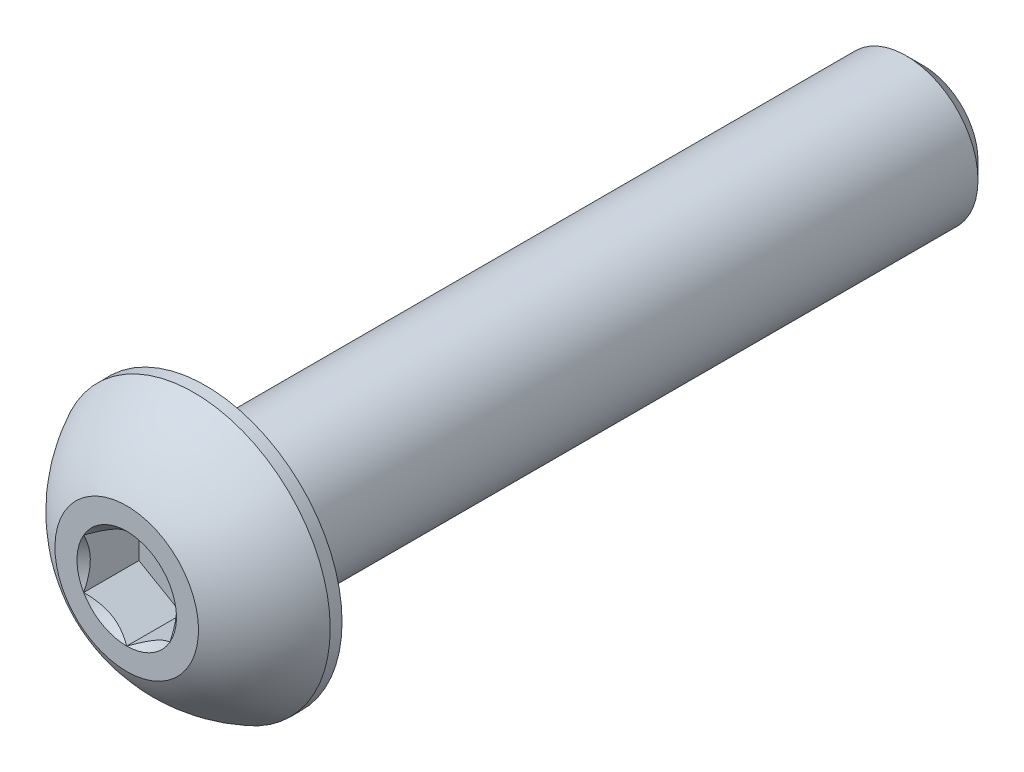
ISO-10303-21;
HEADER;
FILE_DESCRIPTION(('STEP AP214'),'2;1');
FILE_NAME('part.step','',(''),(''),'','','');
FILE_SCHEMA(('AUTOMOTIVE_DESIGN { 1 0 10303 214 1 1 1 1 }'));
ENDSEC;
DATA;
#1=APPLICATION_CONTEXT('core data for automotive mechanical design processes');
#2=APPLICATION_PROTOCOL_DEFINITION('international standard','automotive_design',2000,#1);
#3=PRODUCT_CONTEXT('',#1,'mechanical');
#4=PRODUCT('Part','Part','',(#3));
#5=PRODUCT_RELATED_PRODUCT_CATEGORY('part','',(#4));
#6=PRODUCT_DEFINITION_FORMATION('','',#4);
#7=PRODUCT_DEFINITION_CONTEXT('part definition',#1,'design');
#8=PRODUCT_DEFINITION('design','',#6,#7);
#9=PRODUCT_DEFINITION_SHAPE('','',#8);
#10=(LENGTH_UNIT() NAMED_UNIT(*) SI_UNIT(.MILLI.,.METRE.));
#11=(NAMED_UNIT(*) PLANE_ANGLE_UNIT() SI_UNIT($,.RADIAN.));
#12=(NAMED_UNIT(*) SI_UNIT($,.STERADIAN.) SOLID_ANGLE_UNIT());
#13=UNCERTAINTY_MEASURE_WITH_UNIT(LENGTH_MEASURE(1.E-05),#10,'distance_accuracy_value','');
#14=(GEOMETRIC_REPRESENTATION_CONTEXT(3) GLOBAL_UNCERTAINTY_ASSIGNED_CONTEXT((#13)) GLOBAL_UNIT_ASSIGNED_CONTEXT((#10,
#11,#12)) REPRESENTATION_CONTEXT('',''));
#15=CARTESIAN_POINT('',(0.,0.,0.));
#16=DIRECTION('',(0.,0.,1.));
#17=DIRECTION('',(1.,0.,0.));
#18=AXIS2_PLACEMENT_3D('',#15,#16,#17);
#19=CARTESIAN_POINT('',(0.,0.,-27.75));
#20=DIRECTION('',(0.,0.,1.));
#21=DIRECTION('',(1.,0.,0.));
#22=AXIS2_PLACEMENT_3D('',#19,#20,#21);
#23=PLANE('',#22);
#24=CARTESIAN_POINT('',(0.,0.,-27.75));
#25=DIRECTION('',(0.,0.,1.));
#26=DIRECTION('',(1.,0.,0.));
#27=AXIS2_PLACEMENT_3D('',#24,#25,#26);
#28=CIRCLE('',#27,1.90000000000001);
#29=CARTESIAN_POINT('',(1.90000000000001,0.,-27.75));
#30=VERTEX_POINT('',#29);
#31=EDGE_CURVE('E45',#30,#30,#28,.T.);
#32=ORIENTED_EDGE('',*,*,#31,.F.);
#33=EDGE_LOOP('',(#32));
#34=FACE_BOUND('',#33,.T.);
#35=ADVANCED_FACE('F42',(#34),#23,.F.);
#36=CARTESIAN_POINT('',(0.,0.,-27.75));
#37=DIRECTION('',(0.,0.,1.));
#38=DIRECTION('',(1.,0.,0.));
#39=AXIS2_PLACEMENT_3D('',#36,#37,#38);
#40=CONICAL_SURFACE('',#39,1.90000000000001,0.785398163397448);
#41=CARTESIAN_POINT('',(0.,0.,-27.15));
#42=DIRECTION('',(0.,0.,1.));
#43=DIRECTION('',(1.,0.,0.));
#44=AXIS2_PLACEMENT_3D('',#41,#42,#43);
#45=CIRCLE('',#44,2.50000000000001);
#46=CARTESIAN_POINT('',(2.50000000000001,0.,-27.15));
#47=VERTEX_POINT('',#46);
#48=EDGE_CURVE('E138',#47,#47,#45,.T.);
#49=ORIENTED_EDGE('',*,*,#48,.F.);
#50=EDGE_LOOP('',(#49));
#51=FACE_BOUND('',#50,.T.);
#52=ORIENTED_EDGE('',*,*,#31,.T.);
#53=EDGE_LOOP('',(#52));
#54=FACE_BOUND('',#53,.T.);
#55=ADVANCED_FACE('F159',(#51,#54),#40,.T.);
#56=CARTESIAN_POINT('',(0.,0.,0.));
#57=DIRECTION('',(0.,0.,1.));
#58=DIRECTION('',(1.,0.,0.));
#59=AXIS2_PLACEMENT_3D('',#56,#57,#58);
#60=CYLINDRICAL_SURFACE('',#59,2.50000000000001);
#61=CARTESIAN_POINT('',(0.,0.,-2.75));
#62=DIRECTION('',(0.,0.,1.));
#63=DIRECTION('',(1.,0.,0.));
#64=AXIS2_PLACEMENT_3D('',#61,#62,#63);
#65=CIRCLE('',#64,2.50000000000001);
#66=CARTESIAN_POINT('',(2.50000000000001,0.,-2.75));
#67=VERTEX_POINT('',#66);
#68=EDGE_CURVE('E12',#67,#67,#65,.T.);
#69=ORIENTED_EDGE('',*,*,#68,.F.);
#70=EDGE_LOOP('',(#69));
#71=FACE_BOUND('',#70,.T.);
#72=ORIENTED_EDGE('',*,*,#48,.T.);
#73=EDGE_LOOP('',(#72));
#74=FACE_BOUND('',#73,.T.);
#75=ADVANCED_FACE('F166',(#71,#74),#60,.T.);
#76=CARTESIAN_POINT('',(4.75,0.,-2.75));
#77=DIRECTION('',(0.,0.,-1.));
#78=DIRECTION('',(-1.,0.,0.));
#79=AXIS2_PLACEMENT_3D('',#76,#77,#78);
#80=PLANE('',#79);
#81=ORIENTED_EDGE('',*,*,#68,.T.);
#82=EDGE_LOOP('',(#81));
#83=FACE_BOUND('',#82,.T.);
#84=CARTESIAN_POINT('',(0.,0.,-2.75));
#85=DIRECTION('',(0.,0.,1.));
#86=DIRECTION('',(1.,0.,0.));
#87=AXIS2_PLACEMENT_3D('',#84,#85,#86);
#88=CIRCLE('',#87,4.75);
#89=CARTESIAN_POINT('',(4.75,0.,-2.75));
#90=VERTEX_POINT('',#89);
#91=EDGE_CURVE('E260',#90,#90,#88,.T.);
#92=ORIENTED_EDGE('',*,*,#91,.F.);
#93=EDGE_LOOP('',(#92));
#94=FACE_BOUND('',#93,.T.);
#95=ADVANCED_FACE('F169',(#83,#94),#80,.T.);
#96=CARTESIAN_POINT('',(1.5,-0.866025403784436,-1.925));
#97=DIRECTION('',(0.,0.,1.));
#98=DIRECTION('',(1.,0.,0.));
#99=AXIS2_PLACEMENT_3D('',#96,#97,#98);
#100=PLANE('',#99);
#101=DIRECTION('',(0.866025403784438,0.5,0.));
#102=VECTOR('',#101,1.);
#103=CARTESIAN_POINT('',(0.,-1.73205080756888,-1.925));
#104=LINE('',#103,#102);
#105=CARTESIAN_POINT('',(0.,-1.73205080756888,-1.925));
#106=VERTEX_POINT('',#105);
#107=CARTESIAN_POINT('',(1.5,-0.866025403784436,-1.925));
#108=VERTEX_POINT('',#107);
#109=EDGE_CURVE('E113',#106,#108,#104,.T.);
#110=ORIENTED_EDGE('',*,*,#109,.T.);
#111=DIRECTION('',(0.,1.,0.));
#112=VECTOR('',#111,1.);
#113=CARTESIAN_POINT('',(1.5,-0.866025403784436,-1.925));
#114=LINE('',#113,#112);
#115=CARTESIAN_POINT('',(1.5,0.866025403784438,-1.925));
#116=VERTEX_POINT('',#115);
#117=EDGE_CURVE('E296',#108,#116,#114,.T.);
#118=ORIENTED_EDGE('',*,*,#117,.T.);
#119=DIRECTION('',(-0.866025403784439,0.5,0.));
#120=VECTOR('',#119,1.);
#121=CARTESIAN_POINT('',(1.5,0.866025403784438,-1.925));
#122=LINE('',#121,#120);
#123=CARTESIAN_POINT('',(0.,1.73205080756888,-1.925));
#124=VERTEX_POINT('',#123);
#125=EDGE_CURVE('E292',#116,#124,#122,.T.);
#126=ORIENTED_EDGE('',*,*,#125,.T.);
#127=DIRECTION('',(-0.866025403784439,-0.5,0.));
#128=VECTOR('',#127,1.);
#129=CARTESIAN_POINT('',(0.,1.73205080756888,-1.925));
#130=LINE('',#129,#128);
#131=CARTESIAN_POINT('',(-1.5,0.866025403784438,-1.925));
#132=VERTEX_POINT('',#131);
#133=EDGE_CURVE('E288',#124,#132,#130,.T.);
#134=ORIENTED_EDGE('',*,*,#133,.T.);
#135=DIRECTION('',(0.,-1.,0.));
#136=VECTOR('',#135,1.);
#137=CARTESIAN_POINT('',(-1.5,0.866025403784438,-1.925));
#138=LINE('',#137,#136);
#139=CARTESIAN_POINT('',(-1.5,-0.866025403784438,-1.925));
#140=VERTEX_POINT('',#139);
#141=EDGE_CURVE('E284',#132,#140,#138,.T.);
#142=ORIENTED_EDGE('',*,*,#141,.T.);
#143=DIRECTION('',(0.866025403784439,-0.5,0.));
#144=VECTOR('',#143,1.);
#145=CARTESIAN_POINT('',(-1.5,-0.866025403784438,-1.925));
#146=LINE('',#145,#144);
#147=EDGE_CURVE('E268',#140,#106,#146,.T.);
#148=ORIENTED_EDGE('',*,*,#147,.T.);
#149=EDGE_LOOP('',(#110,#118,#126,#134,#142,#148));
#150=FACE_BOUND('',#149,.T.);
#151=ADVANCED_FACE('F162',(#150),#100,.T.);
#152=CARTESIAN_POINT('',(-1.5,-0.866025403784438,-1.925));
#153=DIRECTION('',(-0.5,-0.866025403784439,0.));
#154=DIRECTION('',(0.866025403784439,-0.5,0.));
#155=AXIS2_PLACEMENT_3D('',#152,#153,#154);
#156=PLANE('',#155);
#157=DIRECTION('',(0.,0.,1.));
#158=VECTOR('',#157,1.);
#159=CARTESIAN_POINT('',(-1.5,-0.866025403784438,-1.925));
#160=LINE('',#159,#158);
#161=CARTESIAN_POINT('',(-1.5,-0.866025403784439,0.));
#162=VERTEX_POINT('',#161);
#163=EDGE_CURVE('E120',#140,#162,#160,.T.);
#164=ORIENTED_EDGE('',*,*,#163,.T.);
#165=CARTESIAN_POINT('',(-1.5002,-0.8659099337306,0.000115481600073141));
#166=CARTESIAN_POINT('',(-1.44863220926292,-0.895682611594165,-0.0296345239326726));
#167=CARTESIAN_POINT('',(-1.3962020823348,-0.925953159489764,-0.0576375160896876));
#168=CARTESIAN_POINT('',(-1.2892909659444,-0.987678321317123,-0.108910769559857));
#169=CARTESIAN_POINT('',(-1.23479980418534,-1.01913880822717,-0.132152494955627));
#170=CARTESIAN_POINT('',(-1.12492091864275,-1.08257741237344,-0.17196627100778));
#171=CARTESIAN_POINT('',(-1.0695611909048,-1.11453936608521,-0.188638414329104));
#172=CARTESIAN_POINT('',(-0.957622742522848,-1.1791670593912,-0.214325543181897));
#173=CARTESIAN_POINT('',(-0.90104744344699,-1.21183082354213,-0.223359709521134));
#174=CARTESIAN_POINT('',(-0.803544610483558,-1.26812411040032,-0.231510918773148));
#175=CARTESIAN_POINT('',(-0.762743091719533,-1.29168087824208,-0.232717747010783));
#176=CARTESIAN_POINT('',(-0.681212030384141,-1.33875285845138,-0.230685942837732));
#177=CARTESIAN_POINT('',(-0.640482505685369,-1.36226806050018,-0.227446329251692));
#178=CARTESIAN_POINT('',(-0.559415597836583,-1.40907206156905,-0.216708014018038));
#179=CARTESIAN_POINT('',(-0.519078615401711,-1.43236062923612,-0.209205346981267));
#180=CARTESIAN_POINT('',(-0.439081663085968,-1.47854689118996,-0.190348388071709));
#181=CARTESIAN_POINT('',(-0.399421991483791,-1.50144441326545,-0.178992442981415));
#182=CARTESIAN_POINT('',(-0.297836865225515,-1.56009461325633,-0.145278352407328));
#183=CARTESIAN_POINT('',(-0.236541446290311,-1.59548353987866,-0.120378150906633));
#184=CARTESIAN_POINT('',(-0.146414371536687,-1.64751843074894,-0.0783433467284239));
#185=CARTESIAN_POINT('',(-0.116714860092283,-1.66466545167617,-0.0635748464409041));
#186=CARTESIAN_POINT('',(-0.0578620986162496,-1.69864410935691,-0.0326894340598317));
#187=CARTESIAN_POINT('',(-0.0287085957793635,-1.7154758920676,-0.01657316587829));
#188=CARTESIAN_POINT('',(0.000199999999999168,-1.73216627762271,0.000115481600072962));
#189=B_SPLINE_CURVE_WITH_KNOTS('',3,(#165,#166,#167,#168,#169,#170,#171,#172,#173,#174,#175,
#176,#177,#178,#179,#180,#181,#182,#183,#184,#185,#186,#187,#188),.UNSPECIFIED.,.F.,.F.,(4,2,2,
2,2,2,2,2,2,2,2,4),(0.,0.199829143693304,0.400822987382388,0.59862372053818,0.795926240188888,
0.93711306795988,1.07833105577193,1.21968061668222,1.36109089931054,1.58570969637565,
1.69770705470963,1.80965120737193),.UNSPECIFIED.);
#190=CARTESIAN_POINT('',(0.,-1.73205080756888,0.));
#191=VERTEX_POINT('',#190);
#192=EDGE_CURVE('E102',#162,#191,#189,.T.);
#193=ORIENTED_EDGE('',*,*,#192,.T.);
#194=DIRECTION('',(0.,0.,1.));
#195=VECTOR('',#194,1.);
#196=CARTESIAN_POINT('',(0.,-1.73205080756888,-1.925));
#197=LINE('',#196,#195);
#198=EDGE_CURVE('E119',#106,#191,#197,.T.);
#199=ORIENTED_EDGE('',*,*,#198,.F.);
#200=ORIENTED_EDGE('',*,*,#147,.F.);
#201=EDGE_LOOP('',(#164,#193,#199,#200));
#202=FACE_BOUND('',#201,.T.);
#203=ADVANCED_FACE('F117',(#202),#156,.F.);
#204=CARTESIAN_POINT('',(0.,-1.73205080756888,-1.925));
#205=DIRECTION('',(0.5,-0.866025403784438,0.));
#206=DIRECTION('',(0.866025403784439,0.5,0.));
#207=AXIS2_PLACEMENT_3D('',#204,#205,#206);
#208=PLANE('',#207);
#209=ORIENTED_EDGE('',*,*,#198,.T.);
#210=CARTESIAN_POINT('',(-0.00020000000000076,-1.73216627762271,0.000115481600073012));
#211=CARTESIAN_POINT('',(0.051367790737075,-1.70239359975915,-0.0296345239326725));
#212=CARTESIAN_POINT('',(0.1037979176652,-1.67212305186355,-0.0576375160896876));
#213=CARTESIAN_POINT('',(0.210709034055596,-1.61039789003619,-0.108910769559858));
#214=CARTESIAN_POINT('',(0.26520019581466,-1.57893740312614,-0.132152494955628));
#215=CARTESIAN_POINT('',(0.375079081357247,-1.51549879897987,-0.171966271007781));
#216=CARTESIAN_POINT('',(0.430438809095198,-1.4835368452681,-0.188638414329104));
#217=CARTESIAN_POINT('',(0.542377257477149,-1.41890915196211,-0.214325543181897));
#218=CARTESIAN_POINT('',(0.598952556553007,-1.38624538781118,-0.223359709521135));
#219=CARTESIAN_POINT('',(0.696455389516439,-1.32995210095299,-0.231510918773149));
#220=CARTESIAN_POINT('',(0.737256908280465,-1.30639533311124,-0.232717747010784));
#221=CARTESIAN_POINT('',(0.818787969615857,-1.25932335290193,-0.230685942837733));
#222=CARTESIAN_POINT('',(0.859517494314628,-1.23580815085313,-0.227446329251693));
#223=CARTESIAN_POINT('',(0.940584402163414,-1.18900414978426,-0.216708014018039));
#224=CARTESIAN_POINT('',(0.980921384598286,-1.16571558211719,-0.209205346981268));
#225=CARTESIAN_POINT('',(1.06091833691403,-1.11952932016335,-0.19034838807171));
#226=CARTESIAN_POINT('',(1.10057800851621,-1.09663179808786,-0.178992442981416));
#227=CARTESIAN_POINT('',(1.20216313477448,-1.03798159809698,-0.145278352407329));
#228=CARTESIAN_POINT('',(1.26345855370969,-1.00259267147465,-0.120378150906634));
#229=CARTESIAN_POINT('',(1.35358562846331,-0.950557780604372,-0.0783433467284242));
#230=CARTESIAN_POINT('',(1.38328513990772,-0.933410759677145,-0.0635748464409042));
#231=CARTESIAN_POINT('',(1.44213790138375,-0.899432101996404,-0.0326894340598314));
#232=CARTESIAN_POINT('',(1.47129140422064,-0.882600319285707,-0.0165731658782896));
#233=CARTESIAN_POINT('',(1.5002,-0.865909933730598,0.000115481600073517));
#234=B_SPLINE_CURVE_WITH_KNOTS('',3,(#210,#211,#212,#213,#214,#215,#216,#217,#218,#219,#220,
#221,#222,#223,#224,#225,#226,#227,#228,#229,#230,#231,#232,#233),.UNSPECIFIED.,.F.,.F.,(4,2,2,
2,2,2,2,2,2,2,2,4),(0.,0.199829143693305,0.400822987382388,0.59862372053818,0.795926240188889,
0.937113067959881,1.07833105577193,1.21968061668222,1.36109089931054,1.58570969637565,
1.69770705470964,1.80965120737194),.UNSPECIFIED.);
#235=CARTESIAN_POINT('',(1.5,-0.866025403784436,0.));
#236=VERTEX_POINT('',#235);
#237=EDGE_CURVE('E109',#191,#236,#234,.T.);
#238=ORIENTED_EDGE('',*,*,#237,.T.);
#239=DIRECTION('',(0.,0.,1.));
#240=VECTOR('',#239,1.);
#241=CARTESIAN_POINT('',(1.5,-0.866025403784436,-1.925));
#242=LINE('',#241,#240);
#243=EDGE_CURVE('E65',#108,#236,#242,.T.);
#244=ORIENTED_EDGE('',*,*,#243,.F.);
#245=ORIENTED_EDGE('',*,*,#109,.F.);
#246=EDGE_LOOP('',(#209,#238,#244,#245));
#247=FACE_BOUND('',#246,.T.);
#248=ADVANCED_FACE('F124',(#247),#208,.F.);
#249=CARTESIAN_POINT('',(1.5,-0.866025403784436,-1.925));
#250=DIRECTION('',(1.,0.,0.));
#251=DIRECTION('',(0.,1.,0.));
#252=AXIS2_PLACEMENT_3D('',#249,#250,#251);
#253=PLANE('',#252);
#254=ORIENTED_EDGE('',*,*,#243,.T.);
#255=CARTESIAN_POINT('',(1.5,-1.72720812969692,0.555578516270788));
#256=CARTESIAN_POINT('',(1.5,-1.68515175699267,0.523829907857423));
#257=CARTESIAN_POINT('',(1.5,-1.64286104748673,0.49239259380738));
#258=CARTESIAN_POINT('',(1.5,-1.55771581035941,0.430269087556407));
#259=CARTESIAN_POINT('',(1.5,-1.51486114386668,0.3995830858922));
#260=CARTESIAN_POINT('',(1.5,-1.3846813415127,0.308407192427159));
#261=CARTESIAN_POINT('',(1.5,-1.29637976071653,0.249288343426771));
#262=CARTESIAN_POINT('',(1.5,-1.11121478730467,0.133230996316503));
#263=CARTESIAN_POINT('',(1.5,-1.01415038238167,0.0766095587330072));
#264=CARTESIAN_POINT('',(1.5,-0.815173408897602,-0.0269631187343471));
#265=CARTESIAN_POINT('',(1.5,-0.713278669253282,-0.0739469584583303));
#266=CARTESIAN_POINT('',(1.5,-0.560333774943109,-0.13142733156917));
#267=CARTESIAN_POINT('',(1.5,-0.51154798294804,-0.14792461224275));
#268=CARTESIAN_POINT('',(1.5,-0.412798620136864,-0.177002487072995));
#269=CARTESIAN_POINT('',(1.5,-0.36283496843756,-0.18958281140598));
#270=CARTESIAN_POINT('',(1.5,-0.26286323544498,-0.209963805853229));
#271=CARTESIAN_POINT('',(1.5,-0.212872113808021,-0.217846367254018));
#272=CARTESIAN_POINT('',(1.5,-0.112355243569544,-0.228677936030995));
#273=CARTESIAN_POINT('',(1.5,-0.0618295883726266,-0.231627791475648));
#274=CARTESIAN_POINT('',(1.5,0.0374291733323851,-0.232375142275149));
#275=CARTESIAN_POINT('',(1.5,0.0861609672002999,-0.230355266441923));
#276=CARTESIAN_POINT('',(1.5,0.183206937768828,-0.22167744710324));
#277=CARTESIAN_POINT('',(1.5,0.231521073438269,-0.215019053031542));
#278=CARTESIAN_POINT('',(1.5,0.328199853425436,-0.197314755877431));
#279=CARTESIAN_POINT('',(1.5,0.376550616310328,-0.18619418874296));
#280=CARTESIAN_POINT('',(1.5,0.472195697125599,-0.160156585951287));
#281=CARTESIAN_POINT('',(1.5,0.519490103092741,-0.145239867959063));
#282=CARTESIAN_POINT('',(1.5,0.668391282696625,-0.0926647764039259));
#283=CARTESIAN_POINT('',(1.5,0.767878709508553,-0.0490187125280229));
#284=CARTESIAN_POINT('',(1.5,0.962179866690724,0.0480229945930991));
#285=CARTESIAN_POINT('',(1.5,1.05697519961444,0.101453665089536));
#286=CARTESIAN_POINT('',(1.5,1.23814273533383,0.21168585200456));
#287=CARTESIAN_POINT('',(1.5,1.3246994218129,0.268187920698598));
#288=CARTESIAN_POINT('',(1.5,1.45222331290673,0.355534301578662));
#289=CARTESIAN_POINT('',(1.5,1.49418091978756,0.384957758680046));
#290=CARTESIAN_POINT('',(1.5,1.57752272931476,0.444582821830467));
#291=CARTESIAN_POINT('',(1.5,1.61890708647354,0.47478421166444));
#292=CARTESIAN_POINT('',(1.5,1.66005278019494,0.505308178609459));
#293=B_SPLINE_CURVE_WITH_KNOTS('',3,(#255,#256,#257,#258,#259,#260,#261,#262,#263,#264,#265,
#266,#267,#268,#269,#270,#271,#272,#273,#274,#275,#276,#277,#278,#279,#280,#281,#282,#283,#284,
#285,#286,#287,#288,#289,#290,#291,#292),.UNSPECIFIED.,.F.,.F.,(4,2,2,2,2,2,2,2,2,2,2,2,2,2,2,2,
2,2,4),(0.,0.158079548982668,0.316198780993941,0.634850417346956,0.971690311361506,
1.30737131660666,1.46173961127088,1.61611853740677,1.76772101421409,1.91929742368537,
2.065387412096,2.21149159305544,2.36014984633872,2.50879566386709,2.83376031422673,
3.15991186985651,3.46985601802197,3.62358896039973,3.7772796264207),.UNSPECIFIED.);
#294=CARTESIAN_POINT('',(1.5,0.866025403784435,0.));
#295=VERTEX_POINT('',#294);
#296=EDGE_CURVE('E189',#236,#295,#293,.T.);
#297=ORIENTED_EDGE('',*,*,#296,.T.);
#298=DIRECTION('',(0.,0.,1.));
#299=VECTOR('',#298,1.);
#300=CARTESIAN_POINT('',(1.5,0.866025403784438,-1.925));
#301=LINE('',#300,#299);
#302=EDGE_CURVE('E269',#116,#295,#301,.T.);
#303=ORIENTED_EDGE('',*,*,#302,.F.);
#304=ORIENTED_EDGE('',*,*,#117,.F.);
#305=EDGE_LOOP('',(#254,#297,#303,#304));
#306=FACE_BOUND('',#305,.T.);
#307=ADVANCED_FACE('F234',(#306),#253,.F.);
#308=CARTESIAN_POINT('',(1.5,0.866025403784438,-1.925));
#309=DIRECTION('',(0.5,0.866025403784439,0.));
#310=DIRECTION('',(-0.866025403784439,0.5,0.));
#311=AXIS2_PLACEMENT_3D('',#308,#309,#310);
#312=PLANE('',#311);
#313=ORIENTED_EDGE('',*,*,#302,.T.);
#314=CARTESIAN_POINT('',(1.5002,0.8659099337306,0.000115481600074659));
#315=CARTESIAN_POINT('',(1.44863220926292,0.895682611594165,-0.029634523932671));
#316=CARTESIAN_POINT('',(1.3962020823348,0.925953159489764,-0.0576375160896862));
#317=CARTESIAN_POINT('',(1.2892909659444,0.987678321317122,-0.108910769559856));
#318=CARTESIAN_POINT('',(1.23479980418534,1.01913880822717,-0.132152494955626));
#319=CARTESIAN_POINT('',(1.12492091864275,1.08257741237344,-0.171966271007779));
#320=CARTESIAN_POINT('',(1.0695611909048,1.11453936608521,-0.188638414329103));
#321=CARTESIAN_POINT('',(0.957622742522849,1.1791670593912,-0.214325543181896));
#322=CARTESIAN_POINT('',(0.901047443446991,1.21183082354213,-0.223359709521133));
#323=CARTESIAN_POINT('',(0.803544610483559,1.26812411040032,-0.231510918773147));
#324=CARTESIAN_POINT('',(0.762743091719533,1.29168087824208,-0.232717747010783));
#325=CARTESIAN_POINT('',(0.681212030384141,1.33875285845138,-0.230685942837732));
#326=CARTESIAN_POINT('',(0.640482505685369,1.36226806050018,-0.227446329251692));
#327=CARTESIAN_POINT('',(0.559415597836583,1.40907206156905,-0.216708014018038));
#328=CARTESIAN_POINT('',(0.519078615401711,1.43236062923612,-0.209205346981266));
#329=CARTESIAN_POINT('',(0.439081663085969,1.47854689118996,-0.190348388071709));
#330=CARTESIAN_POINT('',(0.399421991483792,1.50144441326545,-0.178992442981415));
#331=CARTESIAN_POINT('',(0.297836865225515,1.56009461325633,-0.145278352407328));
#332=CARTESIAN_POINT('',(0.236541446290311,1.59548353987866,-0.120378150906632));
#333=CARTESIAN_POINT('',(0.146414371536687,1.64751843074894,-0.0783433467284234));
#334=CARTESIAN_POINT('',(0.116714860092283,1.66466545167617,-0.0635748464409036));
#335=CARTESIAN_POINT('',(0.0578620986162495,1.69864410935691,-0.0326894340598312));
#336=CARTESIAN_POINT('',(0.0287085957793633,1.7154758920676,-0.0165731658782895));
#337=CARTESIAN_POINT('',(-0.000199999999999511,1.73216627762271,0.000115481600073514));
#338=B_SPLINE_CURVE_WITH_KNOTS('',3,(#314,#315,#316,#317,#318,#319,#320,#321,#322,#323,#324,
#325,#326,#327,#328,#329,#330,#331,#332,#333,#334,#335,#336,#337),.UNSPECIFIED.,.F.,.F.,(4,2,2,
2,2,2,2,2,2,2,2,4),(0.,0.199829143693305,0.400822987382389,0.598623720538181,0.79592624018889,
0.937113067959882,1.07833105577193,1.21968061668222,1.36109089931054,1.58570969637565,
1.69770705470964,1.80965120737194),.UNSPECIFIED.);
#339=CARTESIAN_POINT('',(0.,1.73205080756888,0.));
#340=VERTEX_POINT('',#339);
#341=EDGE_CURVE('E143',#295,#340,#338,.T.);
#342=ORIENTED_EDGE('',*,*,#341,.T.);
#343=DIRECTION('',(0.,0.,1.));
#344=VECTOR('',#343,1.);
#345=CARTESIAN_POINT('',(0.,1.73205080756888,-1.925));
#346=LINE('',#345,#344);
#347=EDGE_CURVE('E273',#124,#340,#346,.T.);
#348=ORIENTED_EDGE('',*,*,#347,.F.);
#349=ORIENTED_EDGE('',*,*,#125,.F.);
#350=EDGE_LOOP('',(#313,#342,#348,#349));
#351=FACE_BOUND('',#350,.T.);
#352=ADVANCED_FACE('F230',(#351),#312,.F.);
#353=CARTESIAN_POINT('',(0.,1.73205080756888,-1.925));
#354=DIRECTION('',(-0.5,0.866025403784439,0.));
#355=DIRECTION('',(-0.866025403784439,-0.5,0.));
#356=AXIS2_PLACEMENT_3D('',#353,#354,#355);
#357=PLANE('',#356);
#358=ORIENTED_EDGE('',*,*,#347,.T.);
#359=CARTESIAN_POINT('',(0.000200000000000433,1.73216627762271,0.000115481600073662));
#360=CARTESIAN_POINT('',(-0.0513677907370754,1.70239359975915,-0.0296345239326721));
#361=CARTESIAN_POINT('',(-0.1037979176652,1.67212305186355,-0.0576375160896873));
#362=CARTESIAN_POINT('',(-0.210709034055596,1.61039789003619,-0.108910769559857));
#363=CARTESIAN_POINT('',(-0.265200195814661,1.57893740312614,-0.132152494955627));
#364=CARTESIAN_POINT('',(-0.375079081357248,1.51549879897987,-0.17196627100778));
#365=CARTESIAN_POINT('',(-0.430438809095199,1.4835368452681,-0.188638414329104));
#366=CARTESIAN_POINT('',(-0.54237725747715,1.41890915196211,-0.214325543181897));
#367=CARTESIAN_POINT('',(-0.598952556553008,1.38624538781118,-0.223359709521134));
#368=CARTESIAN_POINT('',(-0.696455389516441,1.32995210095299,-0.231510918773148));
#369=CARTESIAN_POINT('',(-0.737256908280466,1.30639533311124,-0.232717747010783));
#370=CARTESIAN_POINT('',(-0.818787969615858,1.25932335290193,-0.230685942837733));
#371=CARTESIAN_POINT('',(-0.85951749431463,1.23580815085313,-0.227446329251692));
#372=CARTESIAN_POINT('',(-0.940584402163416,1.18900414978426,-0.216708014018038));
#373=CARTESIAN_POINT('',(-0.980921384598288,1.16571558211719,-0.209205346981267));
#374=CARTESIAN_POINT('',(-1.06091833691403,1.11952932016335,-0.190348388071709));
#375=CARTESIAN_POINT('',(-1.10057800851621,1.09663179808786,-0.178992442981415));
#376=CARTESIAN_POINT('',(-1.20216313477448,1.03798159809698,-0.145278352407328));
#377=CARTESIAN_POINT('',(-1.26345855370969,1.00259267147465,-0.120378150906633));
#378=CARTESIAN_POINT('',(-1.35358562846331,0.950557780604373,-0.0783433467284238));
#379=CARTESIAN_POINT('',(-1.38328513990772,0.933410759677146,-0.063574846440904));
#380=CARTESIAN_POINT('',(-1.44213790138375,0.899432101996406,-0.0326894340598315));
#381=CARTESIAN_POINT('',(-1.47129140422064,0.882600319285709,-0.0165731658782898));
#382=CARTESIAN_POINT('',(-1.5002,0.8659099337306,0.000115481600073161));
#383=B_SPLINE_CURVE_WITH_KNOTS('',3,(#359,#360,#361,#362,#363,#364,#365,#366,#367,#368,#369,
#370,#371,#372,#373,#374,#375,#376,#377,#378,#379,#380,#381,#382),.UNSPECIFIED.,.F.,.F.,(4,2,2,
2,2,2,2,2,2,2,2,4),(0.,0.199829143693305,0.400822987382389,0.598623720538181,0.79592624018889,
0.937113067959882,1.07833105577193,1.21968061668222,1.36109089931054,1.58570969637565,
1.69770705470963,1.80965120737193),.UNSPECIFIED.);
#384=CARTESIAN_POINT('',(-1.5,0.866025403784438,0.));
#385=VERTEX_POINT('',#384);
#386=EDGE_CURVE('E199',#340,#385,#383,.T.);
#387=ORIENTED_EDGE('',*,*,#386,.T.);
#388=DIRECTION('',(0.,0.,1.));
#389=VECTOR('',#388,1.);
#390=CARTESIAN_POINT('',(-1.5,0.866025403784438,-1.925));
#391=LINE('',#390,#389);
#392=EDGE_CURVE('E277',#132,#385,#391,.T.);
#393=ORIENTED_EDGE('',*,*,#392,.F.);
#394=ORIENTED_EDGE('',*,*,#133,.F.);
#395=EDGE_LOOP('',(#358,#387,#393,#394));
#396=FACE_BOUND('',#395,.T.);
#397=ADVANCED_FACE('F226',(#396),#357,.F.);
#398=CARTESIAN_POINT('',(-1.5,0.866025403784438,-1.925));
#399=DIRECTION('',(-1.,0.,0.));
#400=DIRECTION('',(0.,-1.,0.));
#401=AXIS2_PLACEMENT_3D('',#398,#399,#400);
#402=PLANE('',#401);
#403=ORIENTED_EDGE('',*,*,#392,.T.);
#404=CARTESIAN_POINT('',(-1.5,-1.72720812969692,0.55557851627079));
#405=CARTESIAN_POINT('',(-1.5,-1.68515175699268,0.523829907857425));
#406=CARTESIAN_POINT('',(-1.5,-1.64286104748673,0.492392593807382));
#407=CARTESIAN_POINT('',(-1.5,-1.55771581035942,0.430269087556408));
#408=CARTESIAN_POINT('',(-1.5,-1.51486114386668,0.399583085892201));
#409=CARTESIAN_POINT('',(-1.5,-1.3846813415127,0.30840719242716));
#410=CARTESIAN_POINT('',(-1.5,-1.29637976071654,0.249288343426772));
#411=CARTESIAN_POINT('',(-1.5,-1.11121478730467,0.133230996316504));
#412=CARTESIAN_POINT('',(-1.5,-1.01415038238167,0.0766095587330075));
#413=CARTESIAN_POINT('',(-1.5,-0.815173408897605,-0.0269631187343474));
#414=CARTESIAN_POINT('',(-1.5,-0.713278669253285,-0.0739469584583307));
#415=CARTESIAN_POINT('',(-1.5,-0.560333774943112,-0.13142733156917));
#416=CARTESIAN_POINT('',(-1.5,-0.511547982948042,-0.147924612242751));
#417=CARTESIAN_POINT('',(-1.5,-0.412798620136867,-0.177002487072996));
#418=CARTESIAN_POINT('',(-1.5,-0.362834968437563,-0.189582811405981));
#419=CARTESIAN_POINT('',(-1.5,-0.262863235444982,-0.20996380585323));
#420=CARTESIAN_POINT('',(-1.5,-0.212872113808023,-0.21784636725402));
#421=CARTESIAN_POINT('',(-1.5,-0.112355243569546,-0.228677936030997));
#422=CARTESIAN_POINT('',(-1.5,-0.0618295883726285,-0.231627791475649));
#423=CARTESIAN_POINT('',(-1.5,0.0374291733323832,-0.23237514227515));
#424=CARTESIAN_POINT('',(-1.5,0.086160967200298,-0.230355266441925));
#425=CARTESIAN_POINT('',(-1.5,0.183206937768826,-0.221677447103242));
#426=CARTESIAN_POINT('',(-1.5,0.231521073438268,-0.215019053031544));
#427=CARTESIAN_POINT('',(-1.5,0.328199853425435,-0.197314755877433));
#428=CARTESIAN_POINT('',(-1.5,0.376550616310327,-0.186194188742962));
#429=CARTESIAN_POINT('',(-1.5,0.472195697125597,-0.160156585951289));
#430=CARTESIAN_POINT('',(-1.5,0.519490103092739,-0.145239867959065));
#431=CARTESIAN_POINT('',(-1.5,0.668391282696623,-0.0926647764039278));
#432=CARTESIAN_POINT('',(-1.5,0.767878709508551,-0.0490187125280251));
#433=CARTESIAN_POINT('',(-1.5,0.962179866690722,0.0480229945930965));
#434=CARTESIAN_POINT('',(-1.5,1.05697519961444,0.101453665089533));
#435=CARTESIAN_POINT('',(-1.5,1.23814273533382,0.211685852004557));
#436=CARTESIAN_POINT('',(-1.5,1.32469942181289,0.268187920698595));
#437=CARTESIAN_POINT('',(-1.5,1.45222331290673,0.355534301578658));
#438=CARTESIAN_POINT('',(-1.5,1.49418091978755,0.384957758680042));
#439=CARTESIAN_POINT('',(-1.5,1.57752272931476,0.444582821830462));
#440=CARTESIAN_POINT('',(-1.5,1.61890708647354,0.474784211664436));
#441=CARTESIAN_POINT('',(-1.5,1.66005278019494,0.505308178609454));
#442=B_SPLINE_CURVE_WITH_KNOTS('',3,(#404,#405,#406,#407,#408,#409,#410,#411,#412,#413,#414,
#415,#416,#417,#418,#419,#420,#421,#422,#423,#424,#425,#426,#427,#428,#429,#430,#431,#432,#433,
#434,#435,#436,#437,#438,#439,#440,#441),.UNSPECIFIED.,.F.,.F.,(4,2,2,2,2,2,2,2,2,2,2,2,2,2,2,2,
2,2,4),(0.,0.158079548982668,0.316198780993941,0.634850417346957,0.971690311361509,
1.30737131660667,1.46173961127088,1.61611853740677,1.76772101421409,1.91929742368538,
2.065387412096,2.21149159305544,2.36014984633872,2.50879566386709,2.83376031422673,
3.15991186985651,3.46985601802197,3.62358896039973,3.7772796264207),.UNSPECIFIED.);
#443=EDGE_CURVE('E122',#385,#162,#442,.F.);
#444=ORIENTED_EDGE('',*,*,#443,.T.);
#445=ORIENTED_EDGE('',*,*,#163,.F.);
#446=ORIENTED_EDGE('',*,*,#141,.F.);
#447=EDGE_LOOP('',(#403,#444,#445,#446));
#448=FACE_BOUND('',#447,.T.);
#449=ADVANCED_FACE('F223',(#448),#402,.F.);
#450=CARTESIAN_POINT('',(0.,0.,0.));
#451=DIRECTION('',(0.,0.,1.));
#452=DIRECTION('',(1.,0.,0.));
#453=AXIS2_PLACEMENT_3D('',#450,#451,#452);
#454=CONICAL_SURFACE('',#453,1.73205080756888,0.78539816339745);
#455=CARTESIAN_POINT('',(0.,0.,0.));
#456=DIRECTION('',(0.,0.,1.));
#457=DIRECTION('',(1.,0.,0.));
#458=AXIS2_PLACEMENT_3D('',#455,#456,#457);
#459=CIRCLE('',#458,1.73205080756888);
#460=EDGE_CURVE('E99',#162,#191,#459,.T.);
#461=ORIENTED_EDGE('',*,*,#460,.T.);
#462=ORIENTED_EDGE('',*,*,#192,.F.);
#463=EDGE_LOOP('',(#461,#462));
#464=FACE_BOUND('',#463,.T.);
#465=ADVANCED_FACE('F100',(#464),#454,.F.);
#466=EDGE_CURVE('E57',#191,#236,#459,.T.);
#467=ORIENTED_EDGE('',*,*,#466,.T.);
#468=ORIENTED_EDGE('',*,*,#237,.F.);
#469=EDGE_LOOP('',(#467,#468));
#470=FACE_BOUND('',#469,.T.);
#471=ADVANCED_FACE('F110',(#470),#454,.F.);
#472=EDGE_CURVE('E135',#236,#295,#459,.T.);
#473=ORIENTED_EDGE('',*,*,#472,.T.);
#474=ORIENTED_EDGE('',*,*,#296,.F.);
#475=EDGE_LOOP('',(#473,#474));
#476=FACE_BOUND('',#475,.T.);
#477=ADVANCED_FACE('F184',(#476),#454,.F.);
#478=EDGE_CURVE('E139',#295,#340,#459,.T.);
#479=ORIENTED_EDGE('',*,*,#478,.T.);
#480=ORIENTED_EDGE('',*,*,#341,.F.);
#481=EDGE_LOOP('',(#479,#480));
#482=FACE_BOUND('',#481,.T.);
#483=ADVANCED_FACE('F322',(#482),#454,.F.);
#484=EDGE_CURVE('E142',#340,#385,#459,.T.);
#485=ORIENTED_EDGE('',*,*,#484,.T.);
#486=ORIENTED_EDGE('',*,*,#386,.F.);
#487=EDGE_LOOP('',(#485,#486));
#488=FACE_BOUND('',#487,.T.);
#489=ADVANCED_FACE('F318',(#488),#454,.F.);
#490=EDGE_CURVE('E107',#385,#162,#459,.T.);
#491=ORIENTED_EDGE('',*,*,#490,.T.);
#492=ORIENTED_EDGE('',*,*,#443,.F.);
#493=EDGE_LOOP('',(#491,#492));
#494=FACE_BOUND('',#493,.T.);
#495=ADVANCED_FACE('F248',(#494),#454,.F.);
#496=CARTESIAN_POINT('',(0.,-2.50000000000001,0.));
#497=DIRECTION('',(0.,0.,-1.));
#498=DIRECTION('',(-1.,0.,0.));
#499=AXIS2_PLACEMENT_3D('',#496,#497,#498);
#500=PLANE('',#499);
#501=ORIENTED_EDGE('',*,*,#490,.F.);
#502=ORIENTED_EDGE('',*,*,#484,.F.);
#503=ORIENTED_EDGE('',*,*,#478,.F.);
#504=ORIENTED_EDGE('',*,*,#472,.F.);
#505=ORIENTED_EDGE('',*,*,#466,.F.);
#506=ORIENTED_EDGE('',*,*,#460,.F.);
#507=EDGE_LOOP('',(#501,#502,#503,#504,#505,#506));
#508=FACE_BOUND('',#507,.T.);
#509=CARTESIAN_POINT('',(0.,0.,0.));
#510=DIRECTION('',(0.,0.,1.));
#511=DIRECTION('',(1.,0.,0.));
#512=AXIS2_PLACEMENT_3D('',#509,#510,#511);
#513=CIRCLE('',#512,2.50000000000001);
#514=CARTESIAN_POINT('',(0.,-2.50000000000002,0.));
#515=VERTEX_POINT('',#514);
#516=EDGE_CURVE('E256',#515,#515,#513,.T.);
#517=ORIENTED_EDGE('',*,*,#516,.T.);
#518=EDGE_LOOP('',(#517));
#519=FACE_BOUND('',#518,.T.);
#520=ADVANCED_FACE('F131',(#508,#519),#500,.F.);
#521=CARTESIAN_POINT('',(0.,0.,-4.65805481283422));
#522=DIRECTION('',(0.,0.,1.));
#523=DIRECTION('',(0.,-1.,0.));
#524=AXIS2_PLACEMENT_3D('',#521,#522,#523);
#525=SPHERICAL_SURFACE('',#524,5.28653711226623);
#526=CARTESIAN_POINT('',(0.,0.,-2.3375));
#527=DIRECTION('',(0.,0.,1.));
#528=DIRECTION('',(1.,0.,0.));
#529=AXIS2_PLACEMENT_3D('',#526,#527,#528);
#530=CIRCLE('',#529,4.75);
#531=CARTESIAN_POINT('',(0.,-4.75,-2.3375));
#532=VERTEX_POINT('',#531);
#533=EDGE_CURVE('E128',#532,#532,#530,.T.);
#534=CARTESIAN_POINT('',(0.,-2.50000000000002,0.));
#535=CARTESIAN_POINT('',(0.,-2.53026679982019,-0.0162442824556097));
#536=CARTESIAN_POINT('',(0.,-2.56037522904969,-0.0327836412064135));
#537=CARTESIAN_POINT('',(0.,-2.62026400427659,-0.0664460518821879));
#538=CARTESIAN_POINT('',(0.,-2.65004435027398,-0.0835691038071584));
#539=CARTESIAN_POINT('',(0.,-2.70926561698585,-0.118392441415041));
#540=CARTESIAN_POINT('',(0.,-2.73870653770034,-0.136092727097953));
#541=CARTESIAN_POINT('',(0.,-2.79723777417105,-0.172063794044947));
#542=CARTESIAN_POINT('',(0.,-2.82632808992727,-0.190334575309028));
#543=CARTESIAN_POINT('',(0.,-2.88414706107591,-0.227439694392678));
#544=CARTESIAN_POINT('',(0.,-2.91287571646832,-0.246274032212247));
#545=CARTESIAN_POINT('',(0.,-2.96996045130295,-0.284499106978591));
#546=CARTESIAN_POINT('',(0.,-2.99831653074516,-0.303889843925367));
#547=CARTESIAN_POINT('',(0.,-3.05464533901893,-0.343220349244855));
#548=CARTESIAN_POINT('',(0.,-3.08261806785048,-0.363160117617568));
#549=CARTESIAN_POINT('',(0.,-3.13816954607728,-0.403581109164592));
#550=CARTESIAN_POINT('',(0.,-3.16574829547252,-0.424062332338903));
#551=CARTESIAN_POINT('',(0.,-3.22050133565616,-0.465558451209041));
#552=CARTESIAN_POINT('',(0.,-3.24767562644456,-0.486573346904867));
#553=CARTESIAN_POINT('',(0.,-3.30160942393943,-0.529128825735187));
#554=CARTESIAN_POINT('',(0.,-3.32836893064589,-0.55066940886968));
#555=CARTESIAN_POINT('',(0.,-3.38146299210495,-0.594268077753711));
#556=CARTESIAN_POINT('',(0.,-3.40779754685754,-0.616326163503249));
#557=CARTESIAN_POINT('',(0.,-3.46003169800774,-0.660951456155513));
#558=CARTESIAN_POINT('',(0.,-3.48593129440536,-0.683518663058239));
#559=CARTESIAN_POINT('',(0.,-3.53728568771642,-0.729153623103511));
#560=CARTESIAN_POINT('',(0.,-3.56274048462987,-0.752221376246057));
#561=CARTESIAN_POINT('',(0.,-3.61319560685493,-0.798848663663781));
#562=CARTESIAN_POINT('',(0.,-3.63819593216655,-0.822408197938959));
#563=CARTESIAN_POINT('',(0.,-3.68773261175692,-0.870010095651585));
#564=CARTESIAN_POINT('',(0.,-3.71226896603566,-0.894052459089032));
#565=CARTESIAN_POINT('',(0.,-3.76086838042535,-0.942610879694119));
#566=CARTESIAN_POINT('',(0.,-3.7849314405363,-0.967126936861759));
#567=CARTESIAN_POINT('',(0.,-3.83257512329417,-1.01662342950466));
#568=CARTESIAN_POINT('',(0.,-3.85615574594109,-1.04160386497992));
#569=CARTESIAN_POINT('',(0.,-3.90282559378754,-1.0920196223646));
#570=CARTESIAN_POINT('',(0.,-3.92591481898706,-1.11745494427402));
#571=CARTESIAN_POINT('',(0.,-3.97159309867277,-1.16877080980931));
#572=CARTESIAN_POINT('',(0.,-3.99418215315895,-1.19465135343518));
#573=CARTESIAN_POINT('',(0.,-4.03885150820303,-1.24684782851374));
#574=CARTESIAN_POINT('',(0.,-4.06093180876094,-1.27316375996643));
#575=CARTESIAN_POINT('',(0.,-4.10457526604591,-1.32622101137371));
#576=CARTESIAN_POINT('',(0.,-4.12613842277299,-1.3529623313283));
#577=CARTESIAN_POINT('',(0.,-4.16873939899418,-1.40686019877854));
#578=CARTESIAN_POINT('',(0.,-4.1897772184883,-1.4340167462742));
#579=CARTESIAN_POINT('',(0.,-4.23131952645464,-1.488734750071));
#580=CARTESIAN_POINT('',(0.,-4.25182401492687,-1.51629620637214));
#581=CARTESIAN_POINT('',(0.,-4.29229186971308,-1.5718135551894));
#582=CARTESIAN_POINT('',(0.,-4.31225523602708,-1.59976944770551));
#583=CARTESIAN_POINT('',(0.,-4.35163326096594,-1.65606504649041));
#584=CARTESIAN_POINT('',(0.,-4.3710479195908,-1.6844047527592));
#585=CARTESIAN_POINT('',(0.,-4.40932115213664,-1.74145721073709));
#586=CARTESIAN_POINT('',(0.,-4.42817972605763,-1.77016996244618));
#587=CARTESIAN_POINT('',(0.,-4.46533362339398,-1.82795760128832));
#588=CARTESIAN_POINT('',(0.,-4.48362894680935,-1.85703248842136));
#589=CARTESIAN_POINT('',(0.,-4.51964939166499,-1.91553335033325));
#590=CARTESIAN_POINT('',(0.,-4.53737451310527,-1.94495932511209));
#591=CARTESIAN_POINT('',(0.,-4.57224781803529,-2.00415118173238));
#592=CARTESIAN_POINT('',(0.,-4.58939600152503,-2.03391706357382));
#593=CARTESIAN_POINT('',(0.,-4.62310891815402,-2.09377742234707));
#594=CARTESIAN_POINT('',(0.,-4.63967365129327,-2.12387189927887));
#595=CARTESIAN_POINT('',(0.,-4.67221336026297,-2.18437801974018));
#596=CARTESIAN_POINT('',(0.,-4.68818833609342,-2.21478966326969));
#597=CARTESIAN_POINT('',(0.,-4.71954250823692,-2.27591853680649));
#598=CARTESIAN_POINT('',(0.,-4.73492170454996,-2.30663576681378));
#599=CARTESIAN_POINT('',(0.,-4.75,-2.3375));
#600=B_SPLINE_CURVE_WITH_KNOTS('',3,(#534,#535,#536,#537,#538,#539,#540,#541,#542,#543,#544,
#545,#546,#547,#548,#549,#550,#551,#552,#553,#554,#555,#556,#557,#558,#559,#560,#561,#562,#563,
#564,#565,#566,#567,#568,#569,#570,#571,#572,#573,#574,#575,#576,#577,#578,#579,#580,#581,#582,
#583,#584,#585,#586,#587,#588,#589,#590,#591,#592,#593,#594,#595,#596,#597,#598,#599),
.UNSPECIFIED.,.F.,.F.,(4,2,2,2,2,2,2,2,2,2,2,2,2,2,2,2,2,2,2,2,2,2,2,2,2,2,2,2,2,2,2,2,4),(0.,
0.10304982363783,0.20609964727566,0.309149470913491,0.41219929455132,0.51524911818915,
0.61829894182698,0.721348765464809,0.82439858910264,0.92744841274047,1.0304982363783,
1.13354806001613,1.23659788365396,1.33964770729179,1.44269753092962,1.54574735456745,
1.64879717820528,1.75184700184311,1.85489682548094,1.95794664911877,2.0609964727566,
2.16404629639443,2.26709612003226,2.37014594367009,2.47319576730792,2.57624559094575,
2.67929541458358,2.78234523822141,2.88539506185924,2.98844488549707,3.0914947091349,
3.19454453277273,3.29759435641056),.UNSPECIFIED.);
#601=EDGE_CURVE('BSEAM244',#515,#532,#600,.T.);
#602=ORIENTED_EDGE('',*,*,#516,.F.);
#603=ORIENTED_EDGE('',*,*,#533,.T.);
#604=ORIENTED_EDGE('',*,*,#601,.T.);
#605=ORIENTED_EDGE('',*,*,#601,.F.);
#606=EDGE_LOOP('',(#602,#604,#603,#605));
#607=FACE_BOUND('',#606,.T.);
#608=ADVANCED_FACE('F244',(#607),#525,.T.);
#609=CARTESIAN_POINT('',(0.,0.,0.));
#610=DIRECTION('',(0.,0.,1.));
#611=DIRECTION('',(1.,0.,0.));
#612=AXIS2_PLACEMENT_3D('',#609,#610,#611);
#613=CYLINDRICAL_SURFACE('',#612,4.75);
#614=ORIENTED_EDGE('',*,*,#533,.F.);
#615=EDGE_LOOP('',(#614));
#616=FACE_BOUND('',#615,.T.);
#617=ORIENTED_EDGE('',*,*,#91,.T.);
#618=EDGE_LOOP('',(#617));
#619=FACE_BOUND('',#618,.T.);
#620=ADVANCED_FACE('F180',(#616,#619),#613,.T.);
#621=CLOSED_SHELL('',(#35,#55,#75,#95,#151,#203,#248,#307,#352,#397,#449,#465,#471,#477,#483,
#489,#495,#520,#608,#620));
#622=MANIFOLD_SOLID_BREP('B2',#621);
#623=ADVANCED_BREP_SHAPE_REPRESENTATION('',(#18,#622),#14);
#624=SHAPE_DEFINITION_REPRESENTATION(#9,#623);
ENDSEC;
END-ISO-10303-21;
